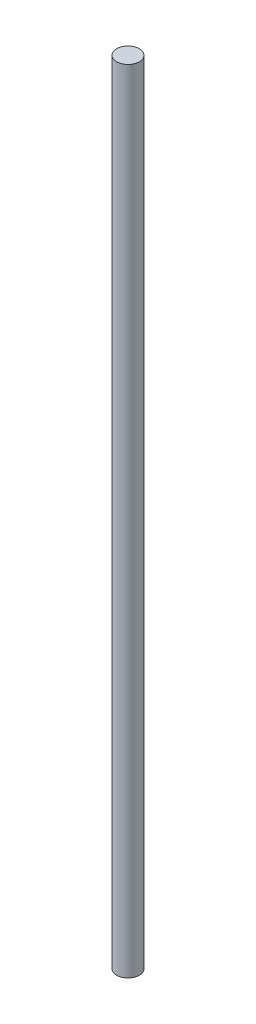
ISO-10303-21;
HEADER;
FILE_DESCRIPTION(('STEP AP214'),'2;1');
FILE_NAME('part.step','',(''),(''),'','','');
FILE_SCHEMA(('AUTOMOTIVE_DESIGN { 1 0 10303 214 1 1 1 1 }'));
ENDSEC;
DATA;
#1=APPLICATION_CONTEXT('core data for automotive mechanical design processes');
#2=APPLICATION_PROTOCOL_DEFINITION('international standard','automotive_design',2000,#1);
#3=PRODUCT_CONTEXT('',#1,'mechanical');
#4=PRODUCT('Part','Part','',(#3));
#5=PRODUCT_RELATED_PRODUCT_CATEGORY('part','',(#4));
#6=PRODUCT_DEFINITION_FORMATION('','',#4);
#7=PRODUCT_DEFINITION_CONTEXT('part definition',#1,'design');
#8=PRODUCT_DEFINITION('design','',#6,#7);
#9=PRODUCT_DEFINITION_SHAPE('','',#8);
#10=(LENGTH_UNIT() NAMED_UNIT(*) SI_UNIT(.MILLI.,.METRE.));
#11=(NAMED_UNIT(*) PLANE_ANGLE_UNIT() SI_UNIT($,.RADIAN.));
#12=(NAMED_UNIT(*) SI_UNIT($,.STERADIAN.) SOLID_ANGLE_UNIT());
#13=UNCERTAINTY_MEASURE_WITH_UNIT(LENGTH_MEASURE(1.E-05),#10,'distance_accuracy_value','');
#14=(GEOMETRIC_REPRESENTATION_CONTEXT(3) GLOBAL_UNCERTAINTY_ASSIGNED_CONTEXT((#13)) GLOBAL_UNIT_ASSIGNED_CONTEXT((#10,
#11,#12)) REPRESENTATION_CONTEXT('',''));
#15=CARTESIAN_POINT('',(0.,0.,0.));
#16=DIRECTION('',(0.,0.,1.));
#17=DIRECTION('',(1.,0.,0.));
#18=AXIS2_PLACEMENT_3D('',#15,#16,#17);
#19=CARTESIAN_POINT('',(0.,280.,0.));
#20=DIRECTION('',(0.,-1.,0.));
#21=DIRECTION('',(0.,0.,-1.));
#22=AXIS2_PLACEMENT_3D('',#19,#20,#21);
#23=CYLINDRICAL_SURFACE('',#22,4.);
#24=CARTESIAN_POINT('',(0.,280.,0.));
#25=DIRECTION('',(0.,1.,0.));
#26=DIRECTION('',(0.,0.,1.));
#27=AXIS2_PLACEMENT_3D('',#24,#25,#26);
#28=CIRCLE('',#27,4.);
#29=CARTESIAN_POINT('',(0.,280.,4.));
#30=VERTEX_POINT('',#29);
#31=EDGE_CURVE('E10',#30,#30,#28,.T.);
#32=ORIENTED_EDGE('',*,*,#31,.F.);
#33=EDGE_LOOP('',(#32));
#34=FACE_BOUND('',#33,.T.);
#35=CARTESIAN_POINT('',(0.,0.,0.));
#36=DIRECTION('',(0.,1.,0.));
#37=DIRECTION('',(0.,0.,1.));
#38=AXIS2_PLACEMENT_3D('',#35,#36,#37);
#39=CIRCLE('',#38,4.);
#40=CARTESIAN_POINT('',(0.,0.,4.));
#41=VERTEX_POINT('',#40);
#42=EDGE_CURVE('E40',#41,#41,#39,.T.);
#43=ORIENTED_EDGE('',*,*,#42,.T.);
#44=EDGE_LOOP('',(#43));
#45=FACE_BOUND('',#44,.T.);
#46=ADVANCED_FACE('F37',(#34,#45),#23,.T.);
#47=CARTESIAN_POINT('',(0.,280.,0.));
#48=DIRECTION('',(0.,1.,0.));
#49=DIRECTION('',(0.,0.,1.));
#50=AXIS2_PLACEMENT_3D('',#47,#48,#49);
#51=PLANE('',#50);
#52=ORIENTED_EDGE('',*,*,#31,.T.);
#53=EDGE_LOOP('',(#52));
#54=FACE_BOUND('',#53,.T.);
#55=ADVANCED_FACE('F54',(#54),#51,.T.);
#56=CARTESIAN_POINT('',(0.,0.,0.));
#57=DIRECTION('',(0.,1.,0.));
#58=DIRECTION('',(0.,0.,1.));
#59=AXIS2_PLACEMENT_3D('',#56,#57,#58);
#60=PLANE('',#59);
#61=ORIENTED_EDGE('',*,*,#42,.F.);
#62=EDGE_LOOP('',(#61));
#63=FACE_BOUND('',#62,.T.);
#64=ADVANCED_FACE('F52',(#63),#60,.F.);
#65=CLOSED_SHELL('',(#46,#55,#64));
#66=MANIFOLD_SOLID_BREP('B2',#65);
#67=ADVANCED_BREP_SHAPE_REPRESENTATION('',(#18,#66),#14);
#68=SHAPE_DEFINITION_REPRESENTATION(#9,#67);
ENDSEC;
END-ISO-10303-21;
